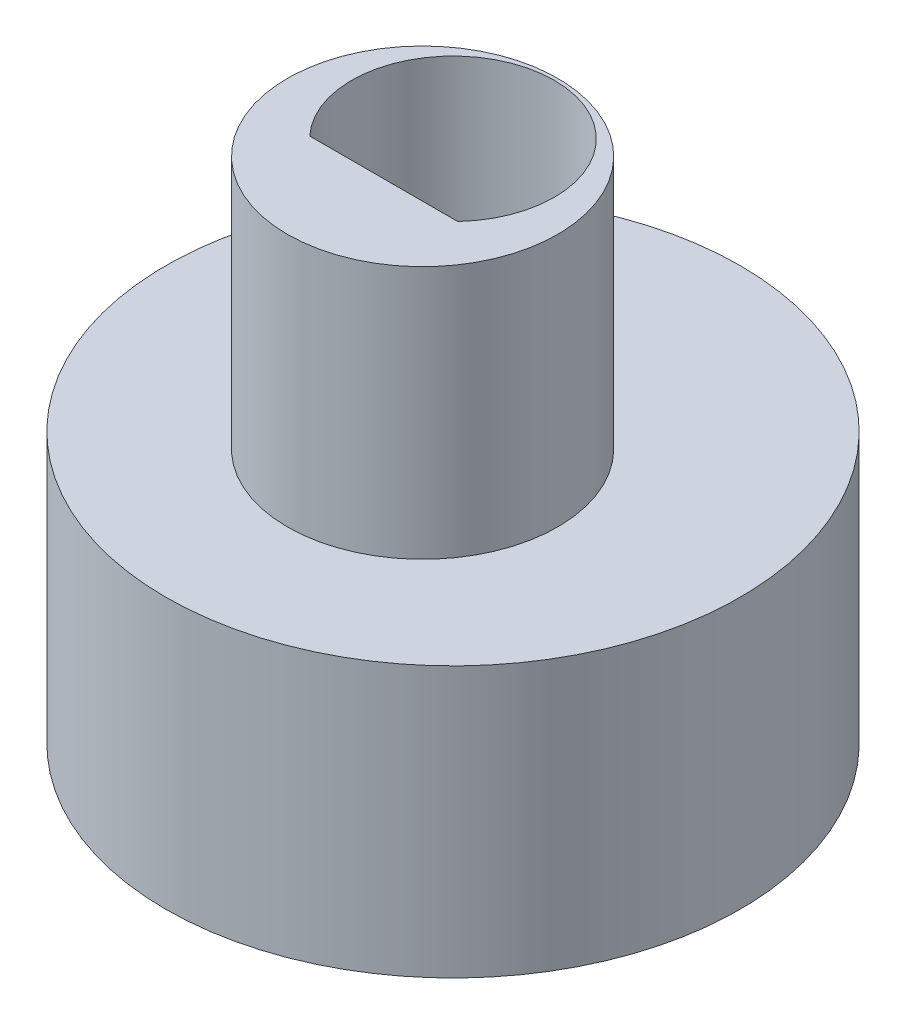
ISO-10303-21;
HEADER;
FILE_DESCRIPTION(('STEP AP214'),'2;1');
FILE_NAME('part.step','',(''),(''),'','','');
FILE_SCHEMA(('AUTOMOTIVE_DESIGN { 1 0 10303 214 1 1 1 1 }'));
ENDSEC;
DATA;
#1=APPLICATION_CONTEXT('core data for automotive mechanical design processes');
#2=APPLICATION_PROTOCOL_DEFINITION('international standard','automotive_design',2000,#1);
#3=PRODUCT_CONTEXT('',#1,'mechanical');
#4=PRODUCT('Part','Part','',(#3));
#5=PRODUCT_RELATED_PRODUCT_CATEGORY('part','',(#4));
#6=PRODUCT_DEFINITION_FORMATION('','',#4);
#7=PRODUCT_DEFINITION_CONTEXT('part definition',#1,'design');
#8=PRODUCT_DEFINITION('design','',#6,#7);
#9=PRODUCT_DEFINITION_SHAPE('','',#8);
#10=(LENGTH_UNIT() NAMED_UNIT(*) SI_UNIT(.MILLI.,.METRE.));
#11=(NAMED_UNIT(*) PLANE_ANGLE_UNIT() SI_UNIT($,.RADIAN.));
#12=(NAMED_UNIT(*) SI_UNIT($,.STERADIAN.) SOLID_ANGLE_UNIT());
#13=UNCERTAINTY_MEASURE_WITH_UNIT(LENGTH_MEASURE(1.E-05),#10,'distance_accuracy_value','');
#14=(GEOMETRIC_REPRESENTATION_CONTEXT(3) GLOBAL_UNCERTAINTY_ASSIGNED_CONTEXT((#13)) GLOBAL_UNIT_ASSIGNED_CONTEXT((#10,
#11,#12)) REPRESENTATION_CONTEXT('',''));
#15=CARTESIAN_POINT('',(0.,0.,0.));
#16=DIRECTION('',(0.,0.,1.));
#17=DIRECTION('',(1.,0.,0.));
#18=AXIS2_PLACEMENT_3D('',#15,#16,#17);
#19=CARTESIAN_POINT('',(0.,7.5,0.));
#20=DIRECTION('',(0.,1.,0.));
#21=DIRECTION('',(0.,0.,1.));
#22=AXIS2_PLACEMENT_3D('',#19,#20,#21);
#23=PLANE('',#22);
#24=CARTESIAN_POINT('',(0.,7.5,0.));
#25=DIRECTION('',(0.,1.,0.));
#26=DIRECTION('',(0.,0.,1.));
#27=AXIS2_PLACEMENT_3D('',#24,#25,#26);
#28=CIRCLE('',#27,4.);
#29=CARTESIAN_POINT('',(0.,7.5,4.));
#30=VERTEX_POINT('',#29);
#31=EDGE_CURVE('E11',#30,#30,#28,.T.);
#32=ORIENTED_EDGE('',*,*,#31,.T.);
#33=EDGE_LOOP('',(#32));
#34=FACE_BOUND('',#33,.T.);
#35=CARTESIAN_POINT('',(0.,7.5,-0.9));
#36=DIRECTION('',(0.,1.,0.));
#37=DIRECTION('',(0.,0.,1.));
#38=AXIS2_PLACEMENT_3D('',#35,#36,#37);
#39=CIRCLE('',#38,3.);
#40=CARTESIAN_POINT('',(2.19031961138095,7.5,1.15));
#41=VERTEX_POINT('',#40);
#42=CARTESIAN_POINT('',(-2.19031961138095,7.5,1.15));
#43=VERTEX_POINT('',#42);
#44=EDGE_CURVE('E54',#41,#43,#39,.T.);
#45=ORIENTED_EDGE('',*,*,#44,.F.);
#46=DIRECTION('',(-1.,0.,0.));
#47=VECTOR('',#46,1.);
#48=CARTESIAN_POINT('',(0.,7.5,1.15));
#49=LINE('',#48,#47);
#50=EDGE_CURVE('E42',#41,#43,#49,.T.);
#51=ORIENTED_EDGE('',*,*,#50,.T.);
#52=EDGE_LOOP('',(#45,#51));
#53=FACE_BOUND('',#52,.T.);
#54=ADVANCED_FACE('F33',(#34,#53),#23,.T.);
#55=CARTESIAN_POINT('',(0.,7.5,0.));
#56=DIRECTION('',(0.,-1.,0.));
#57=DIRECTION('',(0.,0.,-1.));
#58=AXIS2_PLACEMENT_3D('',#55,#56,#57);
#59=CYLINDRICAL_SURFACE('',#58,4.);
#60=ORIENTED_EDGE('',*,*,#31,.F.);
#61=EDGE_LOOP('',(#60));
#62=FACE_BOUND('',#61,.T.);
#63=CARTESIAN_POINT('',(0.,0.,0.));
#64=DIRECTION('',(0.,1.,0.));
#65=DIRECTION('',(0.,0.,1.));
#66=AXIS2_PLACEMENT_3D('',#63,#64,#65);
#67=CIRCLE('',#66,4.);
#68=CARTESIAN_POINT('',(0.,0.,4.));
#69=VERTEX_POINT('',#68);
#70=EDGE_CURVE('E37',#69,#69,#67,.T.);
#71=ORIENTED_EDGE('',*,*,#70,.T.);
#72=EDGE_LOOP('',(#71));
#73=FACE_BOUND('',#72,.T.);
#74=ADVANCED_FACE('F35',(#62,#73),#59,.T.);
#75=CARTESIAN_POINT('',(0.,10.,1.15));
#76=DIRECTION('',(0.,0.,-1.));
#77=DIRECTION('',(-1.,0.,0.));
#78=AXIS2_PLACEMENT_3D('',#75,#76,#77);
#79=PLANE('',#78);
#80=DIRECTION('',(0.,-1.,0.));
#81=VECTOR('',#80,1.);
#82=CARTESIAN_POINT('',(2.19031961138095,10.,1.15));
#83=LINE('',#82,#81);
#84=CARTESIAN_POINT('',(2.19031961138095,-8.,1.15));
#85=VERTEX_POINT('',#84);
#86=EDGE_CURVE('E49',#41,#85,#83,.T.);
#87=ORIENTED_EDGE('',*,*,#86,.T.);
#88=DIRECTION('',(-1.,0.,0.));
#89=VECTOR('',#88,1.);
#90=CARTESIAN_POINT('',(-2.19031961138095,-8.,1.15));
#91=LINE('',#90,#89);
#92=CARTESIAN_POINT('',(-2.19031961138095,-8.,1.15));
#93=VERTEX_POINT('',#92);
#94=EDGE_CURVE('E68',#85,#93,#91,.T.);
#95=ORIENTED_EDGE('',*,*,#94,.T.);
#96=DIRECTION('',(0.,-1.,0.));
#97=VECTOR('',#96,1.);
#98=CARTESIAN_POINT('',(-2.19031961138095,10.,1.15));
#99=LINE('',#98,#97);
#100=EDGE_CURVE('E59',#43,#93,#99,.T.);
#101=ORIENTED_EDGE('',*,*,#100,.F.);
#102=ORIENTED_EDGE('',*,*,#50,.F.);
#103=EDGE_LOOP('',(#87,#95,#101,#102));
#104=FACE_BOUND('',#103,.T.);
#105=ADVANCED_FACE('F69',(#104),#79,.T.);
#106=CARTESIAN_POINT('',(0.,10.,-0.9));
#107=DIRECTION('',(0.,-1.,0.));
#108=DIRECTION('',(0.,0.,-1.));
#109=AXIS2_PLACEMENT_3D('',#106,#107,#108);
#110=CYLINDRICAL_SURFACE('',#109,3.);
#111=ORIENTED_EDGE('',*,*,#44,.T.);
#112=ORIENTED_EDGE('',*,*,#100,.T.);
#113=CARTESIAN_POINT('',(0.,-8.,-0.9));
#114=DIRECTION('',(0.,-1.,0.));
#115=DIRECTION('',(0.,0.,-1.));
#116=AXIS2_PLACEMENT_3D('',#113,#114,#115);
#117=CIRCLE('',#116,3.);
#118=EDGE_CURVE('E63',#93,#85,#117,.T.);
#119=ORIENTED_EDGE('',*,*,#118,.T.);
#120=ORIENTED_EDGE('',*,*,#86,.F.);
#121=EDGE_LOOP('',(#111,#112,#119,#120));
#122=FACE_BOUND('',#121,.T.);
#123=ADVANCED_FACE('F61',(#122),#110,.F.);
#124=CARTESIAN_POINT('',(0.,-8.,-0.9));
#125=DIRECTION('',(0.,-1.,0.));
#126=DIRECTION('',(0.,0.,-1.));
#127=AXIS2_PLACEMENT_3D('',#124,#125,#126);
#128=PLANE('',#127);
#129=CARTESIAN_POINT('',(0.,-8.,-0.9));
#130=DIRECTION('',(0.,-1.,0.));
#131=DIRECTION('',(0.,0.,-1.));
#132=AXIS2_PLACEMENT_3D('',#129,#130,#131);
#133=CIRCLE('',#132,8.5);
#134=CARTESIAN_POINT('',(0.,-8.,-9.4));
#135=VERTEX_POINT('',#134);
#136=EDGE_CURVE('E76',#135,#135,#133,.T.);
#137=ORIENTED_EDGE('',*,*,#136,.T.);
#138=EDGE_LOOP('',(#137));
#139=FACE_BOUND('',#138,.T.);
#140=ORIENTED_EDGE('',*,*,#94,.F.);
#141=ORIENTED_EDGE('',*,*,#118,.F.);
#142=EDGE_LOOP('',(#140,#141));
#143=FACE_BOUND('',#142,.T.);
#144=ADVANCED_FACE('F73',(#139,#143),#128,.T.);
#145=CARTESIAN_POINT('',(0.,0.,-0.9));
#146=DIRECTION('',(0.,-1.,0.));
#147=DIRECTION('',(0.,0.,-1.));
#148=AXIS2_PLACEMENT_3D('',#145,#146,#147);
#149=PLANE('',#148);
#150=ORIENTED_EDGE('',*,*,#70,.F.);
#151=EDGE_LOOP('',(#150));
#152=FACE_BOUND('',#151,.T.);
#153=CARTESIAN_POINT('',(0.,0.,-0.9));
#154=DIRECTION('',(0.,-1.,0.));
#155=DIRECTION('',(0.,0.,-1.));
#156=AXIS2_PLACEMENT_3D('',#153,#154,#155);
#157=CIRCLE('',#156,8.5);
#158=CARTESIAN_POINT('',(0.,0.,-9.4));
#159=VERTEX_POINT('',#158);
#160=EDGE_CURVE('E71',#159,#159,#157,.T.);
#161=ORIENTED_EDGE('',*,*,#160,.F.);
#162=EDGE_LOOP('',(#161));
#163=FACE_BOUND('',#162,.T.);
#164=ADVANCED_FACE('F98',(#152,#163),#149,.F.);
#165=CARTESIAN_POINT('',(0.,-8.,-0.9));
#166=DIRECTION('',(0.,1.,0.));
#167=DIRECTION('',(0.,0.,1.));
#168=AXIS2_PLACEMENT_3D('',#165,#166,#167);
#169=CYLINDRICAL_SURFACE('',#168,8.5);
#170=ORIENTED_EDGE('',*,*,#136,.F.);
#171=EDGE_LOOP('',(#170));
#172=FACE_BOUND('',#171,.T.);
#173=ORIENTED_EDGE('',*,*,#160,.T.);
#174=EDGE_LOOP('',(#173));
#175=FACE_BOUND('',#174,.T.);
#176=ADVANCED_FACE('F95',(#172,#175),#169,.T.);
#177=CLOSED_SHELL('',(#54,#74,#105,#123,#144,#164,#176));
#178=MANIFOLD_SOLID_BREP('B2',#177);
#179=ADVANCED_BREP_SHAPE_REPRESENTATION('',(#18,#178),#14);
#180=SHAPE_DEFINITION_REPRESENTATION(#9,#179);
ENDSEC;
END-ISO-10303-21;
